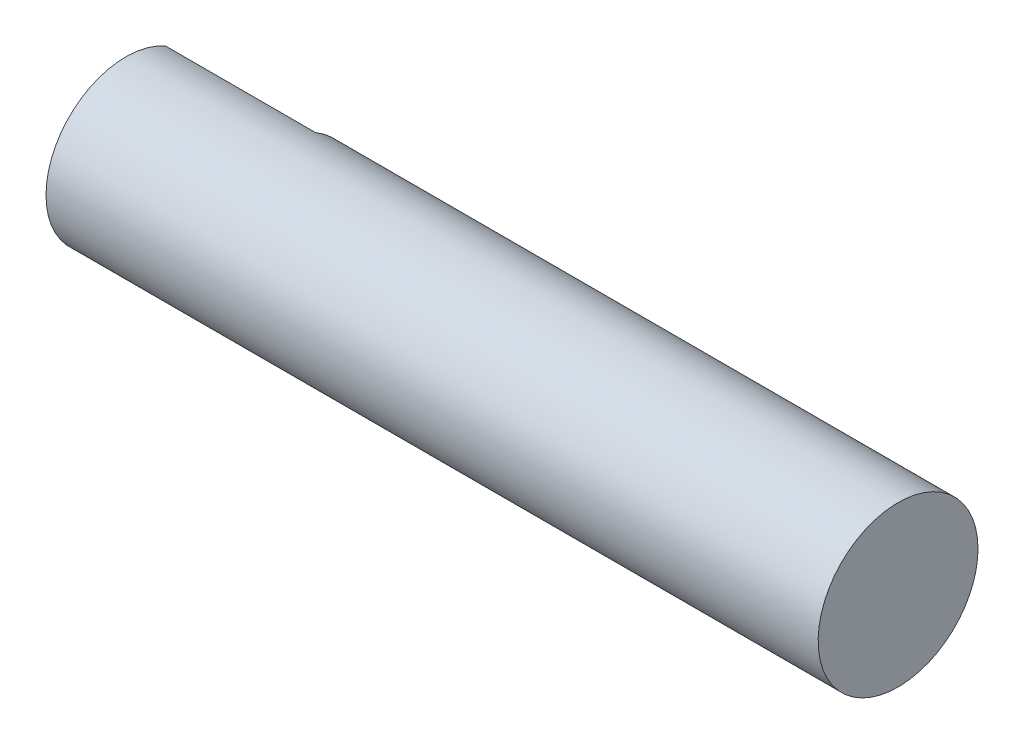
ISO-10303-21;
HEADER;
FILE_DESCRIPTION(('STEP AP214'),'2;1');
FILE_NAME('part.step','',(''),(''),'','','');
FILE_SCHEMA(('AUTOMOTIVE_DESIGN { 1 0 10303 214 1 1 1 1 }'));
ENDSEC;
DATA;
#1=APPLICATION_CONTEXT('core data for automotive mechanical design processes');
#2=APPLICATION_PROTOCOL_DEFINITION('international standard','automotive_design',2000,#1);
#3=PRODUCT_CONTEXT('',#1,'mechanical');
#4=PRODUCT('Part','Part','',(#3));
#5=PRODUCT_RELATED_PRODUCT_CATEGORY('part','',(#4));
#6=PRODUCT_DEFINITION_FORMATION('','',#4);
#7=PRODUCT_DEFINITION_CONTEXT('part definition',#1,'design');
#8=PRODUCT_DEFINITION('design','',#6,#7);
#9=PRODUCT_DEFINITION_SHAPE('','',#8);
#10=(LENGTH_UNIT() NAMED_UNIT(*) SI_UNIT(.MILLI.,.METRE.));
#11=(NAMED_UNIT(*) PLANE_ANGLE_UNIT() SI_UNIT($,.RADIAN.));
#12=(NAMED_UNIT(*) SI_UNIT($,.STERADIAN.) SOLID_ANGLE_UNIT());
#13=UNCERTAINTY_MEASURE_WITH_UNIT(LENGTH_MEASURE(1.E-05),#10,'distance_accuracy_value','');
#14=(GEOMETRIC_REPRESENTATION_CONTEXT(3) GLOBAL_UNCERTAINTY_ASSIGNED_CONTEXT((#13)) GLOBAL_UNIT_ASSIGNED_CONTEXT((#10,
#11,#12)) REPRESENTATION_CONTEXT('',''));
#15=CARTESIAN_POINT('',(0.,0.,0.));
#16=DIRECTION('',(0.,0.,1.));
#17=DIRECTION('',(1.,0.,0.));
#18=AXIS2_PLACEMENT_3D('',#15,#16,#17);
#19=CARTESIAN_POINT('',(7.5,0.,0.));
#20=DIRECTION('',(-1.,0.,0.));
#21=DIRECTION('',(0.,0.,1.));
#22=AXIS2_PLACEMENT_3D('',#19,#20,#21);
#23=CYLINDRICAL_SURFACE('',#22,3.995);
#24=CARTESIAN_POINT('',(0.,0.,0.));
#25=DIRECTION('',(1.,0.,0.));
#26=DIRECTION('',(0.,0.,-1.));
#27=AXIS2_PLACEMENT_3D('',#24,#25,#26);
#28=CIRCLE('',#27,3.995);
#29=CARTESIAN_POINT('',(0.,3.46695832106473,-1.985));
#30=VERTEX_POINT('',#29);
#31=CARTESIAN_POINT('',(0.,-3.46695832106473,-1.985));
#32=VERTEX_POINT('',#31);
#33=EDGE_CURVE('E81',#30,#32,#28,.T.);
#34=ORIENTED_EDGE('',*,*,#33,.T.);
#35=DIRECTION('',(-1.,0.,0.));
#36=VECTOR('',#35,1.);
#37=CARTESIAN_POINT('',(7.5,-3.46695832106473,-1.985));
#38=LINE('',#37,#36);
#39=CARTESIAN_POINT('',(7.5,-3.46695832106473,-1.985));
#40=VERTEX_POINT('',#39);
#41=EDGE_CURVE('E11',#40,#32,#38,.T.);
#42=ORIENTED_EDGE('',*,*,#41,.F.);
#43=CARTESIAN_POINT('',(7.5,0.,0.));
#44=DIRECTION('',(1.,0.,0.));
#45=DIRECTION('',(0.,0.,-1.));
#46=AXIS2_PLACEMENT_3D('',#43,#44,#45);
#47=CIRCLE('',#46,3.995);
#48=CARTESIAN_POINT('',(7.5,3.46695832106473,-1.985));
#49=VERTEX_POINT('',#48);
#50=EDGE_CURVE('E75',#40,#49,#47,.T.);
#51=ORIENTED_EDGE('',*,*,#50,.T.);
#52=DIRECTION('',(-1.,0.,0.));
#53=VECTOR('',#52,1.);
#54=CARTESIAN_POINT('',(7.5,3.46695832106473,-1.985));
#55=LINE('',#54,#53);
#56=EDGE_CURVE('E51',#49,#30,#55,.T.);
#57=ORIENTED_EDGE('',*,*,#56,.T.);
#58=EDGE_LOOP('',(#34,#42,#51,#57));
#59=FACE_BOUND('',#58,.T.);
#60=CARTESIAN_POINT('',(38.6,0.,0.));
#61=DIRECTION('',(1.,0.,0.));
#62=DIRECTION('',(0.,0.,-1.));
#63=AXIS2_PLACEMENT_3D('',#60,#61,#62);
#64=CIRCLE('',#63,3.995);
#65=CARTESIAN_POINT('',(38.6,0.,-3.995));
#66=VERTEX_POINT('',#65);
#67=EDGE_CURVE('E78',#66,#66,#64,.T.);
#68=ORIENTED_EDGE('',*,*,#67,.F.);
#69=EDGE_LOOP('',(#68));
#70=FACE_BOUND('',#69,.T.);
#71=ADVANCED_FACE('F43',(#59,#70),#23,.T.);
#72=CARTESIAN_POINT('',(7.5,3.46695832106473,-1.985));
#73=DIRECTION('',(0.,0.,1.));
#74=DIRECTION('',(1.,0.,0.));
#75=AXIS2_PLACEMENT_3D('',#72,#73,#74);
#76=PLANE('',#75);
#77=DIRECTION('',(0.,1.,0.));
#78=VECTOR('',#77,1.);
#79=CARTESIAN_POINT('',(0.,3.46695832106473,-1.985));
#80=LINE('',#79,#78);
#81=EDGE_CURVE('E66',#32,#30,#80,.T.);
#82=ORIENTED_EDGE('',*,*,#81,.T.);
#83=ORIENTED_EDGE('',*,*,#56,.F.);
#84=DIRECTION('',(0.,1.,0.));
#85=VECTOR('',#84,1.);
#86=CARTESIAN_POINT('',(7.5,3.46695832106473,-1.985));
#87=LINE('',#86,#85);
#88=EDGE_CURVE('E57',#40,#49,#87,.T.);
#89=ORIENTED_EDGE('',*,*,#88,.F.);
#90=ORIENTED_EDGE('',*,*,#41,.T.);
#91=EDGE_LOOP('',(#82,#83,#89,#90));
#92=FACE_BOUND('',#91,.T.);
#93=ADVANCED_FACE('F68',(#92),#76,.F.);
#94=CARTESIAN_POINT('',(0.,0.,0.));
#95=DIRECTION('',(1.,0.,0.));
#96=DIRECTION('',(0.,0.,-1.));
#97=AXIS2_PLACEMENT_3D('',#94,#95,#96);
#98=PLANE('',#97);
#99=ORIENTED_EDGE('',*,*,#33,.F.);
#100=ORIENTED_EDGE('',*,*,#81,.F.);
#101=EDGE_LOOP('',(#99,#100));
#102=FACE_BOUND('',#101,.T.);
#103=ADVANCED_FACE('F85',(#102),#98,.F.);
#104=CARTESIAN_POINT('',(7.5,0.,0.));
#105=DIRECTION('',(1.,0.,0.));
#106=DIRECTION('',(0.,0.,-1.));
#107=AXIS2_PLACEMENT_3D('',#104,#105,#106);
#108=PLANE('',#107);
#109=ORIENTED_EDGE('',*,*,#50,.F.);
#110=ORIENTED_EDGE('',*,*,#88,.T.);
#111=EDGE_LOOP('',(#109,#110));
#112=FACE_BOUND('',#111,.T.);
#113=ADVANCED_FACE('F74',(#112),#108,.F.);
#114=CARTESIAN_POINT('',(38.6,0.,0.));
#115=DIRECTION('',(1.,0.,0.));
#116=DIRECTION('',(0.,0.,-1.));
#117=AXIS2_PLACEMENT_3D('',#114,#115,#116);
#118=PLANE('',#117);
#119=ORIENTED_EDGE('',*,*,#67,.T.);
#120=EDGE_LOOP('',(#119));
#121=FACE_BOUND('',#120,.T.);
#122=ADVANCED_FACE('F92',(#121),#118,.T.);
#123=CLOSED_SHELL('',(#71,#93,#103,#113,#122));
#124=MANIFOLD_SOLID_BREP('B2',#123);
#125=ADVANCED_BREP_SHAPE_REPRESENTATION('',(#18,#124),#14);
#126=SHAPE_DEFINITION_REPRESENTATION(#9,#125);
ENDSEC;
END-ISO-10303-21;
